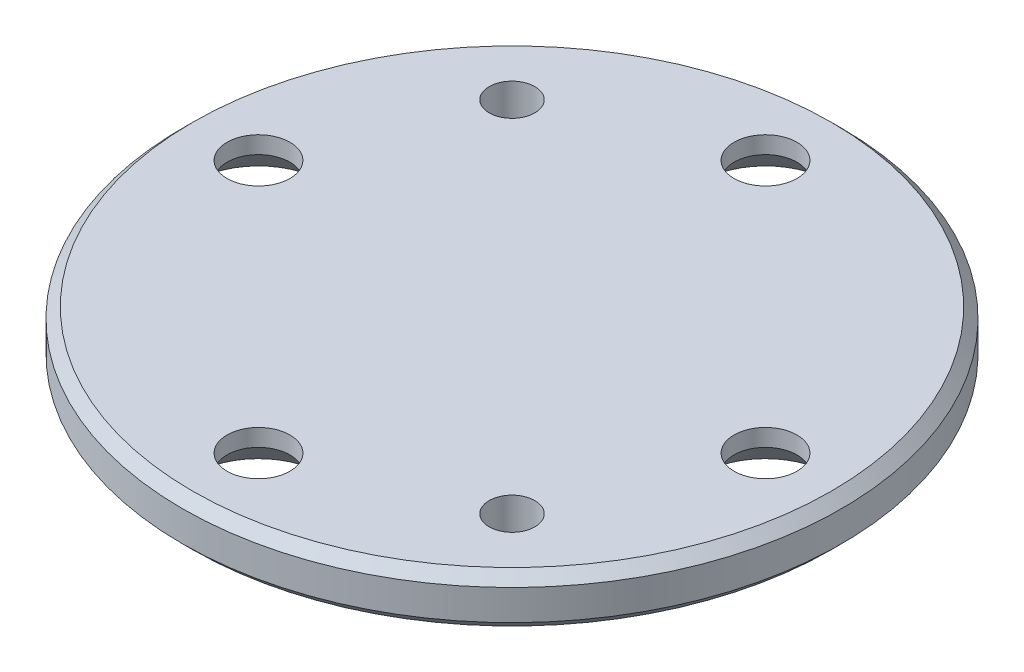
ISO-10303-21;
HEADER;
FILE_DESCRIPTION(('STEP AP214'),'2;1');
FILE_NAME('part.step','',(''),(''),'','','');
FILE_SCHEMA(('AUTOMOTIVE_DESIGN { 1 0 10303 214 1 1 1 1 }'));
ENDSEC;
DATA;
#1=APPLICATION_CONTEXT('core data for automotive mechanical design processes');
#2=APPLICATION_PROTOCOL_DEFINITION('international standard','automotive_design',2000,#1);
#3=PRODUCT_CONTEXT('',#1,'mechanical');
#4=PRODUCT('Part','Part','',(#3));
#5=PRODUCT_RELATED_PRODUCT_CATEGORY('part','',(#4));
#6=PRODUCT_DEFINITION_FORMATION('','',#4);
#7=PRODUCT_DEFINITION_CONTEXT('part definition',#1,'design');
#8=PRODUCT_DEFINITION('design','',#6,#7);
#9=PRODUCT_DEFINITION_SHAPE('','',#8);
#10=(LENGTH_UNIT() NAMED_UNIT(*) SI_UNIT(.MILLI.,.METRE.));
#11=(NAMED_UNIT(*) PLANE_ANGLE_UNIT() SI_UNIT($,.RADIAN.));
#12=(NAMED_UNIT(*) SI_UNIT($,.STERADIAN.) SOLID_ANGLE_UNIT());
#13=UNCERTAINTY_MEASURE_WITH_UNIT(LENGTH_MEASURE(1.E-05),#10,'distance_accuracy_value','');
#14=(GEOMETRIC_REPRESENTATION_CONTEXT(3) GLOBAL_UNCERTAINTY_ASSIGNED_CONTEXT((#13)) GLOBAL_UNIT_ASSIGNED_CONTEXT((#10,
#11,#12)) REPRESENTATION_CONTEXT('',''));
#15=CARTESIAN_POINT('',(0.,0.,0.));
#16=DIRECTION('',(0.,0.,1.));
#17=DIRECTION('',(1.,0.,0.));
#18=AXIS2_PLACEMENT_3D('',#15,#16,#17);
#19=CARTESIAN_POINT('',(0.,5.,0.));
#20=DIRECTION('',(0.,1.,0.));
#21=DIRECTION('',(0.,0.,1.));
#22=AXIS2_PLACEMENT_3D('',#19,#20,#21);
#23=PLANE('',#22);
#24=CARTESIAN_POINT('',(0.,5.,0.));
#25=DIRECTION('',(0.,1.,0.));
#26=DIRECTION('',(0.,0.,1.));
#27=AXIS2_PLACEMENT_3D('',#24,#25,#26);
#28=CIRCLE('',#27,31.5);
#29=CARTESIAN_POINT('',(0.,5.,31.5));
#30=VERTEX_POINT('',#29);
#31=EDGE_CURVE('E85',#30,#30,#28,.T.);
#32=ORIENTED_EDGE('',*,*,#31,.T.);
#33=EDGE_LOOP('',(#32));
#34=FACE_BOUND('',#33,.T.);
#35=CARTESIAN_POINT('',(-17.6776695296636,5.,-17.6776695296638));
#36=DIRECTION('',(0.,1.,0.));
#37=DIRECTION('',(0.,0.,1.));
#38=AXIS2_PLACEMENT_3D('',#35,#36,#37);
#39=CIRCLE('',#38,2.25);
#40=CARTESIAN_POINT('',(-17.6776695296636,5.,-15.4276695296638));
#41=VERTEX_POINT('',#40);
#42=EDGE_CURVE('E126',#41,#41,#39,.T.);
#43=ORIENTED_EDGE('',*,*,#42,.F.);
#44=EDGE_LOOP('',(#43));
#45=FACE_BOUND('',#44,.T.);
#46=CARTESIAN_POINT('',(25.,5.,0.));
#47=DIRECTION('',(0.,1.,0.));
#48=DIRECTION('',(0.,0.,1.));
#49=AXIS2_PLACEMENT_3D('',#46,#47,#48);
#50=CIRCLE('',#49,3.1);
#51=CARTESIAN_POINT('',(25.,5.,3.1));
#52=VERTEX_POINT('',#51);
#53=EDGE_CURVE('E120',#52,#52,#50,.T.);
#54=ORIENTED_EDGE('',*,*,#53,.F.);
#55=EDGE_LOOP('',(#54));
#56=FACE_BOUND('',#55,.T.);
#57=CARTESIAN_POINT('',(-25.,5.,0.));
#58=DIRECTION('',(0.,1.,0.));
#59=DIRECTION('',(0.,0.,1.));
#60=AXIS2_PLACEMENT_3D('',#57,#58,#59);
#61=CIRCLE('',#60,3.1);
#62=CARTESIAN_POINT('',(-25.,5.,3.1));
#63=VERTEX_POINT('',#62);
#64=EDGE_CURVE('E114',#63,#63,#61,.T.);
#65=ORIENTED_EDGE('',*,*,#64,.F.);
#66=EDGE_LOOP('',(#65));
#67=FACE_BOUND('',#66,.T.);
#68=CARTESIAN_POINT('',(0.,5.,-25.));
#69=DIRECTION('',(0.,1.,0.));
#70=DIRECTION('',(0.,0.,1.));
#71=AXIS2_PLACEMENT_3D('',#68,#69,#70);
#72=CIRCLE('',#71,3.1);
#73=CARTESIAN_POINT('',(0.,5.,-21.9));
#74=VERTEX_POINT('',#73);
#75=EDGE_CURVE('E117',#74,#74,#72,.T.);
#76=ORIENTED_EDGE('',*,*,#75,.F.);
#77=EDGE_LOOP('',(#76));
#78=FACE_BOUND('',#77,.T.);
#79=CARTESIAN_POINT('',(0.,5.,25.));
#80=DIRECTION('',(0.,1.,0.));
#81=DIRECTION('',(0.,0.,1.));
#82=AXIS2_PLACEMENT_3D('',#79,#80,#81);
#83=CIRCLE('',#82,3.1);
#84=CARTESIAN_POINT('',(0.,5.,28.1));
#85=VERTEX_POINT('',#84);
#86=EDGE_CURVE('E123',#85,#85,#83,.T.);
#87=ORIENTED_EDGE('',*,*,#86,.F.);
#88=EDGE_LOOP('',(#87));
#89=FACE_BOUND('',#88,.T.);
#90=CARTESIAN_POINT('',(17.6776695296636,5.,17.6776695296638));
#91=DIRECTION('',(0.,1.,0.));
#92=DIRECTION('',(0.,0.,1.));
#93=AXIS2_PLACEMENT_3D('',#90,#91,#92);
#94=CIRCLE('',#93,2.25);
#95=CARTESIAN_POINT('',(17.6776695296636,5.,19.9276695296638));
#96=VERTEX_POINT('',#95);
#97=EDGE_CURVE('E130',#96,#96,#94,.T.);
#98=ORIENTED_EDGE('',*,*,#97,.F.);
#99=EDGE_LOOP('',(#98));
#100=FACE_BOUND('',#99,.T.);
#101=ADVANCED_FACE('F70',(#34,#45,#56,#67,#78,#89,#100),#23,.T.);
#102=CARTESIAN_POINT('',(0.,0.,0.));
#103=DIRECTION('',(0.,1.,0.));
#104=DIRECTION('',(0.,0.,1.));
#105=AXIS2_PLACEMENT_3D('',#102,#103,#104);
#106=PLANE('',#105);
#107=CARTESIAN_POINT('',(0.,0.,0.));
#108=DIRECTION('',(0.,1.,0.));
#109=DIRECTION('',(0.,0.,1.));
#110=AXIS2_PLACEMENT_3D('',#107,#108,#109);
#111=CIRCLE('',#110,31.5);
#112=CARTESIAN_POINT('',(0.,0.,31.5));
#113=VERTEX_POINT('',#112);
#114=EDGE_CURVE('E11',#113,#113,#111,.F.);
#115=ORIENTED_EDGE('',*,*,#114,.T.);
#116=EDGE_LOOP('',(#115));
#117=FACE_BOUND('',#116,.T.);
#118=CARTESIAN_POINT('',(0.,0.,-25.));
#119=DIRECTION('',(0.,1.,0.));
#120=DIRECTION('',(0.,0.,1.));
#121=AXIS2_PLACEMENT_3D('',#118,#119,#120);
#122=CIRCLE('',#121,6.39999999999999);
#123=CARTESIAN_POINT('',(0.,0.,-18.6));
#124=VERTEX_POINT('',#123);
#125=EDGE_CURVE('E102',#124,#124,#122,.T.);
#126=ORIENTED_EDGE('',*,*,#125,.T.);
#127=EDGE_LOOP('',(#126));
#128=FACE_BOUND('',#127,.T.);
#129=CARTESIAN_POINT('',(25.,0.,0.));
#130=DIRECTION('',(0.,1.,0.));
#131=DIRECTION('',(0.,0.,1.));
#132=AXIS2_PLACEMENT_3D('',#129,#130,#131);
#133=CIRCLE('',#132,6.39999999999998);
#134=CARTESIAN_POINT('',(25.,0.,6.39999999999998));
#135=VERTEX_POINT('',#134);
#136=EDGE_CURVE('E105',#135,#135,#133,.T.);
#137=ORIENTED_EDGE('',*,*,#136,.T.);
#138=EDGE_LOOP('',(#137));
#139=FACE_BOUND('',#138,.T.);
#140=CARTESIAN_POINT('',(0.,0.,25.));
#141=DIRECTION('',(0.,1.,0.));
#142=DIRECTION('',(0.,0.,1.));
#143=AXIS2_PLACEMENT_3D('',#140,#141,#142);
#144=CIRCLE('',#143,6.39999999999999);
#145=CARTESIAN_POINT('',(0.,0.,31.4));
#146=VERTEX_POINT('',#145);
#147=EDGE_CURVE('E108',#146,#146,#144,.T.);
#148=ORIENTED_EDGE('',*,*,#147,.T.);
#149=EDGE_LOOP('',(#148));
#150=FACE_BOUND('',#149,.T.);
#151=CARTESIAN_POINT('',(-25.,0.,0.));
#152=DIRECTION('',(0.,1.,0.));
#153=DIRECTION('',(0.,0.,1.));
#154=AXIS2_PLACEMENT_3D('',#151,#152,#153);
#155=CIRCLE('',#154,6.39999999999998);
#156=CARTESIAN_POINT('',(-25.,0.,6.39999999999999));
#157=VERTEX_POINT('',#156);
#158=EDGE_CURVE('E111',#157,#157,#155,.T.);
#159=ORIENTED_EDGE('',*,*,#158,.T.);
#160=EDGE_LOOP('',(#159));
#161=FACE_BOUND('',#160,.T.);
#162=CARTESIAN_POINT('',(-17.6776695296636,0.,-17.6776695296638));
#163=DIRECTION('',(0.,1.,0.));
#164=DIRECTION('',(0.,0.,1.));
#165=AXIS2_PLACEMENT_3D('',#162,#163,#164);
#166=CIRCLE('',#165,2.25);
#167=CARTESIAN_POINT('',(-17.6776695296636,0.,-15.4276695296638));
#168=VERTEX_POINT('',#167);
#169=EDGE_CURVE('E127',#168,#168,#166,.T.);
#170=ORIENTED_EDGE('',*,*,#169,.T.);
#171=EDGE_LOOP('',(#170));
#172=FACE_BOUND('',#171,.T.);
#173=CARTESIAN_POINT('',(17.6776695296636,0.,17.6776695296638));
#174=DIRECTION('',(0.,1.,0.));
#175=DIRECTION('',(0.,0.,1.));
#176=AXIS2_PLACEMENT_3D('',#173,#174,#175);
#177=CIRCLE('',#176,2.25);
#178=CARTESIAN_POINT('',(17.6776695296636,0.,19.9276695296638));
#179=VERTEX_POINT('',#178);
#180=EDGE_CURVE('E133',#179,#179,#177,.T.);
#181=ORIENTED_EDGE('',*,*,#180,.T.);
#182=EDGE_LOOP('',(#181));
#183=FACE_BOUND('',#182,.T.);
#184=ADVANCED_FACE('F143',(#117,#128,#139,#150,#161,#172,#183),#106,.F.);
#185=CARTESIAN_POINT('',(0.,5.,0.));
#186=DIRECTION('',(0.,-1.,0.));
#187=DIRECTION('',(0.,0.,-1.));
#188=AXIS2_PLACEMENT_3D('',#185,#186,#187);
#189=CYLINDRICAL_SURFACE('',#188,32.5);
#190=CARTESIAN_POINT('',(0.,3.99999999999998,0.));
#191=DIRECTION('',(0.,1.,0.));
#192=DIRECTION('',(0.,0.,1.));
#193=AXIS2_PLACEMENT_3D('',#190,#191,#192);
#194=CIRCLE('',#193,32.5);
#195=CARTESIAN_POINT('',(0.,3.99999999999998,32.5));
#196=VERTEX_POINT('',#195);
#197=EDGE_CURVE('E77',#196,#196,#194,.F.);
#198=ORIENTED_EDGE('',*,*,#197,.T.);
#199=EDGE_LOOP('',(#198));
#200=FACE_BOUND('',#199,.T.);
#201=CARTESIAN_POINT('',(0.,0.999999999999994,0.));
#202=DIRECTION('',(0.,1.,0.));
#203=DIRECTION('',(0.,0.,1.));
#204=AXIS2_PLACEMENT_3D('',#201,#202,#203);
#205=CIRCLE('',#204,32.5);
#206=CARTESIAN_POINT('',(0.,0.999999999999994,32.5));
#207=VERTEX_POINT('',#206);
#208=EDGE_CURVE('E81',#207,#207,#205,.T.);
#209=ORIENTED_EDGE('',*,*,#208,.T.);
#210=EDGE_LOOP('',(#209));
#211=FACE_BOUND('',#210,.T.);
#212=ADVANCED_FACE('F149',(#200,#211),#189,.T.);
#213=CARTESIAN_POINT('',(-25.,5.,0.));
#214=DIRECTION('',(0.,-1.,0.));
#215=DIRECTION('',(0.,0.,-1.));
#216=AXIS2_PLACEMENT_3D('',#213,#214,#215);
#217=CYLINDRICAL_SURFACE('',#216,3.1);
#218=CARTESIAN_POINT('',(-25.,3.30000000000001,0.));
#219=DIRECTION('',(0.,1.,0.));
#220=DIRECTION('',(0.,0.,1.));
#221=AXIS2_PLACEMENT_3D('',#218,#219,#220);
#222=CIRCLE('',#221,3.1);
#223=CARTESIAN_POINT('',(-25.,3.30000000000001,3.1));
#224=VERTEX_POINT('',#223);
#225=EDGE_CURVE('E90',#224,#224,#222,.F.);
#226=ORIENTED_EDGE('',*,*,#225,.T.);
#227=EDGE_LOOP('',(#226));
#228=FACE_BOUND('',#227,.T.);
#229=ORIENTED_EDGE('',*,*,#64,.T.);
#230=EDGE_LOOP('',(#229));
#231=FACE_BOUND('',#230,.T.);
#232=ADVANCED_FACE('F153',(#228,#231),#217,.F.);
#233=CARTESIAN_POINT('',(0.,5.,-25.));
#234=DIRECTION('',(0.,-1.,0.));
#235=DIRECTION('',(0.,0.,-1.));
#236=AXIS2_PLACEMENT_3D('',#233,#234,#235);
#237=CYLINDRICAL_SURFACE('',#236,3.1);
#238=CARTESIAN_POINT('',(0.,3.3,-25.));
#239=DIRECTION('',(0.,1.,0.));
#240=DIRECTION('',(0.,0.,1.));
#241=AXIS2_PLACEMENT_3D('',#238,#239,#240);
#242=CIRCLE('',#241,3.1);
#243=CARTESIAN_POINT('',(0.,3.3,-21.9));
#244=VERTEX_POINT('',#243);
#245=EDGE_CURVE('E99',#244,#244,#242,.F.);
#246=ORIENTED_EDGE('',*,*,#245,.T.);
#247=EDGE_LOOP('',(#246));
#248=FACE_BOUND('',#247,.T.);
#249=ORIENTED_EDGE('',*,*,#75,.T.);
#250=EDGE_LOOP('',(#249));
#251=FACE_BOUND('',#250,.T.);
#252=ADVANCED_FACE('F258',(#248,#251),#237,.F.);
#253=CARTESIAN_POINT('',(25.,5.,0.));
#254=DIRECTION('',(0.,-1.,0.));
#255=DIRECTION('',(0.,0.,-1.));
#256=AXIS2_PLACEMENT_3D('',#253,#254,#255);
#257=CYLINDRICAL_SURFACE('',#256,3.1);
#258=CARTESIAN_POINT('',(25.,3.30000000000001,0.));
#259=DIRECTION('',(0.,1.,0.));
#260=DIRECTION('',(0.,0.,1.));
#261=AXIS2_PLACEMENT_3D('',#258,#259,#260);
#262=CIRCLE('',#261,3.1);
#263=CARTESIAN_POINT('',(25.,3.30000000000001,3.1));
#264=VERTEX_POINT('',#263);
#265=EDGE_CURVE('E96',#264,#264,#262,.F.);
#266=ORIENTED_EDGE('',*,*,#265,.T.);
#267=EDGE_LOOP('',(#266));
#268=FACE_BOUND('',#267,.T.);
#269=ORIENTED_EDGE('',*,*,#53,.T.);
#270=EDGE_LOOP('',(#269));
#271=FACE_BOUND('',#270,.T.);
#272=ADVANCED_FACE('F246',(#268,#271),#257,.F.);
#273=CARTESIAN_POINT('',(0.,5.,25.));
#274=DIRECTION('',(0.,-1.,0.));
#275=DIRECTION('',(0.,0.,-1.));
#276=AXIS2_PLACEMENT_3D('',#273,#274,#275);
#277=CYLINDRICAL_SURFACE('',#276,3.1);
#278=CARTESIAN_POINT('',(0.,3.3,25.));
#279=DIRECTION('',(0.,1.,0.));
#280=DIRECTION('',(0.,0.,1.));
#281=AXIS2_PLACEMENT_3D('',#278,#279,#280);
#282=CIRCLE('',#281,3.1);
#283=CARTESIAN_POINT('',(0.,3.3,28.1));
#284=VERTEX_POINT('',#283);
#285=EDGE_CURVE('E93',#284,#284,#282,.F.);
#286=ORIENTED_EDGE('',*,*,#285,.T.);
#287=EDGE_LOOP('',(#286));
#288=FACE_BOUND('',#287,.T.);
#289=ORIENTED_EDGE('',*,*,#86,.T.);
#290=EDGE_LOOP('',(#289));
#291=FACE_BOUND('',#290,.T.);
#292=ADVANCED_FACE('F240',(#288,#291),#277,.F.);
#293=CARTESIAN_POINT('',(-17.6776695296636,5.,-17.6776695296638));
#294=DIRECTION('',(0.,-1.,0.));
#295=DIRECTION('',(0.,0.,-1.));
#296=AXIS2_PLACEMENT_3D('',#293,#294,#295);
#297=CYLINDRICAL_SURFACE('',#296,2.25);
#298=ORIENTED_EDGE('',*,*,#42,.T.);
#299=EDGE_LOOP('',(#298));
#300=FACE_BOUND('',#299,.T.);
#301=ORIENTED_EDGE('',*,*,#169,.F.);
#302=EDGE_LOOP('',(#301));
#303=FACE_BOUND('',#302,.T.);
#304=ADVANCED_FACE('F245',(#300,#303),#297,.F.);
#305=CARTESIAN_POINT('',(17.6776695296636,5.,17.6776695296638));
#306=DIRECTION('',(0.,-1.,0.));
#307=DIRECTION('',(0.,0.,-1.));
#308=AXIS2_PLACEMENT_3D('',#305,#306,#307);
#309=CYLINDRICAL_SURFACE('',#308,2.25);
#310=ORIENTED_EDGE('',*,*,#97,.T.);
#311=EDGE_LOOP('',(#310));
#312=FACE_BOUND('',#311,.T.);
#313=ORIENTED_EDGE('',*,*,#180,.F.);
#314=EDGE_LOOP('',(#313));
#315=FACE_BOUND('',#314,.T.);
#316=ADVANCED_FACE('F139',(#312,#315),#309,.F.);
#317=CARTESIAN_POINT('',(0.,0.,-25.));
#318=DIRECTION('',(0.,-1.,0.));
#319=DIRECTION('',(0.,0.,-1.));
#320=AXIS2_PLACEMENT_3D('',#317,#318,#319);
#321=CONICAL_SURFACE('',#320,6.39999999999999,0.785398163397447);
#322=ORIENTED_EDGE('',*,*,#245,.F.);
#323=EDGE_LOOP('',(#322));
#324=FACE_BOUND('',#323,.T.);
#325=ORIENTED_EDGE('',*,*,#125,.F.);
#326=EDGE_LOOP('',(#325));
#327=FACE_BOUND('',#326,.T.);
#328=ADVANCED_FACE('F158',(#324,#327),#321,.F.);
#329=CARTESIAN_POINT('',(25.,0.,0.));
#330=DIRECTION('',(0.,-1.,0.));
#331=DIRECTION('',(0.,0.,-1.));
#332=AXIS2_PLACEMENT_3D('',#329,#330,#331);
#333=CONICAL_SURFACE('',#332,6.39999999999998,0.785398163397445);
#334=ORIENTED_EDGE('',*,*,#265,.F.);
#335=EDGE_LOOP('',(#334));
#336=FACE_BOUND('',#335,.T.);
#337=ORIENTED_EDGE('',*,*,#136,.F.);
#338=EDGE_LOOP('',(#337));
#339=FACE_BOUND('',#338,.T.);
#340=ADVANCED_FACE('F161',(#336,#339),#333,.F.);
#341=CARTESIAN_POINT('',(0.,0.,25.));
#342=DIRECTION('',(0.,-1.,0.));
#343=DIRECTION('',(0.,0.,-1.));
#344=AXIS2_PLACEMENT_3D('',#341,#342,#343);
#345=CONICAL_SURFACE('',#344,6.4,0.785398163397448);
#346=ORIENTED_EDGE('',*,*,#285,.F.);
#347=EDGE_LOOP('',(#346));
#348=FACE_BOUND('',#347,.T.);
#349=ORIENTED_EDGE('',*,*,#147,.F.);
#350=EDGE_LOOP('',(#349));
#351=FACE_BOUND('',#350,.T.);
#352=ADVANCED_FACE('F165',(#348,#351),#345,.F.);
#353=CARTESIAN_POINT('',(-25.,0.,0.));
#354=DIRECTION('',(0.,-1.,0.));
#355=DIRECTION('',(0.,0.,-1.));
#356=AXIS2_PLACEMENT_3D('',#353,#354,#355);
#357=CONICAL_SURFACE('',#356,6.39999999999998,0.785398163397445);
#358=ORIENTED_EDGE('',*,*,#225,.F.);
#359=EDGE_LOOP('',(#358));
#360=FACE_BOUND('',#359,.T.);
#361=ORIENTED_EDGE('',*,*,#158,.F.);
#362=EDGE_LOOP('',(#361));
#363=FACE_BOUND('',#362,.T.);
#364=ADVANCED_FACE('F169',(#360,#363),#357,.F.);
#365=CARTESIAN_POINT('',(0.,5.,0.));
#366=DIRECTION('',(0.,-1.,0.));
#367=DIRECTION('',(0.,0.,-1.));
#368=AXIS2_PLACEMENT_3D('',#365,#366,#367);
#369=CONICAL_SURFACE('',#368,31.5,0.785398163397445);
#370=ORIENTED_EDGE('',*,*,#197,.F.);
#371=EDGE_LOOP('',(#370));
#372=FACE_BOUND('',#371,.T.);
#373=ORIENTED_EDGE('',*,*,#31,.F.);
#374=EDGE_LOOP('',(#373));
#375=FACE_BOUND('',#374,.T.);
#376=ADVANCED_FACE('F172',(#372,#375),#369,.T.);
#377=CARTESIAN_POINT('',(0.,0.999999999999994,0.));
#378=DIRECTION('',(0.,1.,0.));
#379=DIRECTION('',(0.,0.,1.));
#380=AXIS2_PLACEMENT_3D('',#377,#378,#379);
#381=CONICAL_SURFACE('',#380,32.5,0.785398163397448);
#382=ORIENTED_EDGE('',*,*,#114,.F.);
#383=EDGE_LOOP('',(#382));
#384=FACE_BOUND('',#383,.T.);
#385=ORIENTED_EDGE('',*,*,#208,.F.);
#386=EDGE_LOOP('',(#385));
#387=FACE_BOUND('',#386,.T.);
#388=ADVANCED_FACE('F72',(#384,#387),#381,.T.);
#389=CLOSED_SHELL('',(#101,#184,#212,#232,#252,#272,#292,#304,#316,#328,#340,#352,#364,#376,#388));
#390=MANIFOLD_SOLID_BREP('B2',#389);
#391=ADVANCED_BREP_SHAPE_REPRESENTATION('',(#18,#390),#14);
#392=SHAPE_DEFINITION_REPRESENTATION(#9,#391);
ENDSEC;
END-ISO-10303-21;
